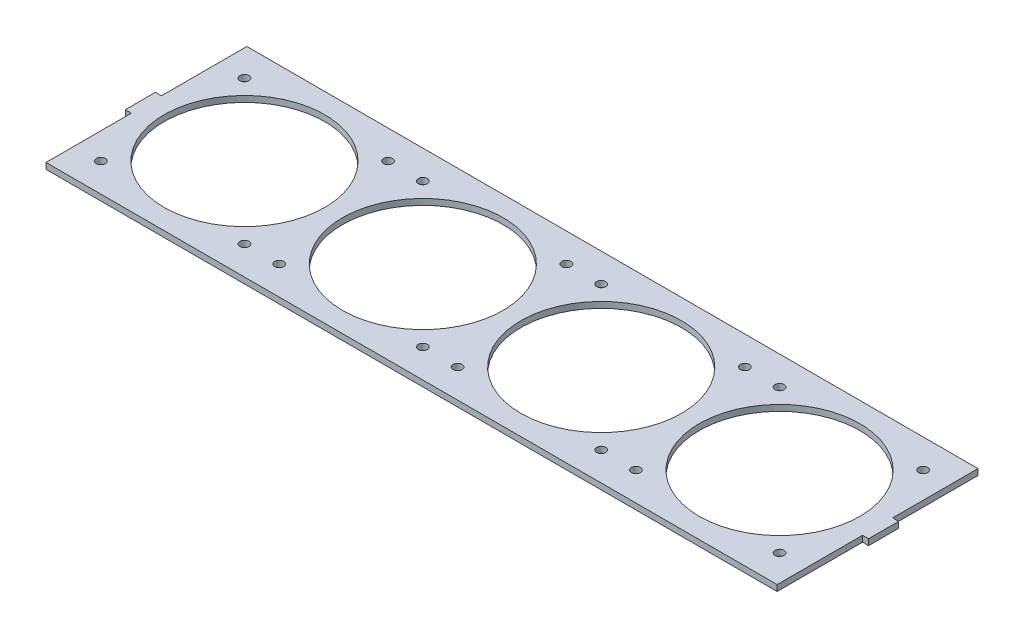
ISO-10303-21;
HEADER;
FILE_DESCRIPTION(('STEP AP214'),'2;1');
FILE_NAME('part.step','',(''),(''),'','','');
FILE_SCHEMA(('AUTOMOTIVE_DESIGN { 1 0 10303 214 1 1 1 1 }'));
ENDSEC;
DATA;
#1=APPLICATION_CONTEXT('core data for automotive mechanical design processes');
#2=APPLICATION_PROTOCOL_DEFINITION('international standard','automotive_design',2000,#1);
#3=PRODUCT_CONTEXT('',#1,'mechanical');
#4=PRODUCT('Part','Part','',(#3));
#5=PRODUCT_RELATED_PRODUCT_CATEGORY('part','',(#4));
#6=PRODUCT_DEFINITION_FORMATION('','',#4);
#7=PRODUCT_DEFINITION_CONTEXT('part definition',#1,'design');
#8=PRODUCT_DEFINITION('design','',#6,#7);
#9=PRODUCT_DEFINITION_SHAPE('','',#8);
#10=(LENGTH_UNIT() NAMED_UNIT(*) SI_UNIT(.MILLI.,.METRE.));
#11=(NAMED_UNIT(*) PLANE_ANGLE_UNIT() SI_UNIT($,.RADIAN.));
#12=(NAMED_UNIT(*) SI_UNIT($,.STERADIAN.) SOLID_ANGLE_UNIT());
#13=UNCERTAINTY_MEASURE_WITH_UNIT(LENGTH_MEASURE(1.E-05),#10,'distance_accuracy_value','');
#14=(GEOMETRIC_REPRESENTATION_CONTEXT(3) GLOBAL_UNCERTAINTY_ASSIGNED_CONTEXT((#13)) GLOBAL_UNIT_ASSIGNED_CONTEXT((#10,
#11,#12)) REPRESENTATION_CONTEXT('',''));
#15=CARTESIAN_POINT('',(0.,0.,0.));
#16=DIRECTION('',(0.,0.,1.));
#17=DIRECTION('',(1.,0.,0.));
#18=AXIS2_PLACEMENT_3D('',#15,#16,#17);
#19=CARTESIAN_POINT('',(0.,3.,0.));
#20=DIRECTION('',(0.,-1.,0.));
#21=DIRECTION('',(0.,0.,-1.));
#22=AXIS2_PLACEMENT_3D('',#19,#20,#21);
#23=PLANE('',#22);
#24=DIRECTION('',(0.,0.,1.));
#25=VECTOR('',#24,1.);
#26=CARTESIAN_POINT('',(-288.537869001243,3.,-7.43515636029034));
#27=LINE('',#26,#25);
#28=CARTESIAN_POINT('',(-288.537869001243,3.,-7.43515636029034));
#29=VERTEX_POINT('',#28);
#30=CARTESIAN_POINT('',(-288.537869001243,3.,35.0648436397097));
#31=VERTEX_POINT('',#30);
#32=EDGE_CURVE('E180',#29,#31,#27,.T.);
#33=ORIENTED_EDGE('',*,*,#32,.T.);
#34=DIRECTION('',(1.,0.,0.));
#35=VECTOR('',#34,1.);
#36=CARTESIAN_POINT('',(75.4621309987569,3.,35.0648436397097));
#37=LINE('',#36,#35);
#38=CARTESIAN_POINT('',(75.4621309987569,3.,35.0648436397097));
#39=VERTEX_POINT('',#38);
#40=EDGE_CURVE('E108',#31,#39,#37,.T.);
#41=ORIENTED_EDGE('',*,*,#40,.T.);
#42=DIRECTION('',(0.,0.,-1.));
#43=VECTOR('',#42,1.);
#44=CARTESIAN_POINT('',(75.4621309987569,3.,-7.43515636029031));
#45=LINE('',#44,#43);
#46=CARTESIAN_POINT('',(75.4621309987569,3.,-7.43515636029031));
#47=VERTEX_POINT('',#46);
#48=EDGE_CURVE('E207',#39,#47,#45,.T.);
#49=ORIENTED_EDGE('',*,*,#48,.T.);
#50=DIRECTION('',(1.,0.,0.));
#51=VECTOR('',#50,1.);
#52=CARTESIAN_POINT('',(78.4621309987569,3.,-7.4351563602903));
#53=LINE('',#52,#51);
#54=CARTESIAN_POINT('',(78.4621309987569,3.,-7.4351563602903));
#55=VERTEX_POINT('',#54);
#56=EDGE_CURVE('E226',#47,#55,#53,.T.);
#57=ORIENTED_EDGE('',*,*,#56,.T.);
#58=DIRECTION('',(0.,0.,-1.));
#59=VECTOR('',#58,1.);
#60=CARTESIAN_POINT('',(78.4621309987569,3.,-7.4351563602903));
#61=LINE('',#60,#59);
#62=CARTESIAN_POINT('',(78.4621309987569,3.,-22.4351563602903));
#63=VERTEX_POINT('',#62);
#64=EDGE_CURVE('E223',#55,#63,#61,.T.);
#65=ORIENTED_EDGE('',*,*,#64,.T.);
#66=DIRECTION('',(-1.,0.,0.));
#67=VECTOR('',#66,1.);
#68=CARTESIAN_POINT('',(78.4621309987569,3.,-22.4351563602903));
#69=LINE('',#68,#67);
#70=CARTESIAN_POINT('',(75.4621309987569,3.,-22.4351563602903));
#71=VERTEX_POINT('',#70);
#72=EDGE_CURVE('E225',#63,#71,#69,.T.);
#73=ORIENTED_EDGE('',*,*,#72,.T.);
#74=DIRECTION('',(0.,0.,-1.));
#75=VECTOR('',#74,1.);
#76=CARTESIAN_POINT('',(75.4621309987569,3.,-64.9351563602903));
#77=LINE('',#76,#75);
#78=CARTESIAN_POINT('',(75.4621309987569,3.,-64.9351563602903));
#79=VERTEX_POINT('',#78);
#80=EDGE_CURVE('E228',#71,#79,#77,.T.);
#81=ORIENTED_EDGE('',*,*,#80,.T.);
#82=DIRECTION('',(-1.,0.,0.));
#83=VECTOR('',#82,1.);
#84=CARTESIAN_POINT('',(75.4621309987569,3.,-64.9351563602903));
#85=LINE('',#84,#83);
#86=CARTESIAN_POINT('',(-288.537869001243,3.,-64.9351563602903));
#87=VERTEX_POINT('',#86);
#88=EDGE_CURVE('E234',#79,#87,#85,.T.);
#89=ORIENTED_EDGE('',*,*,#88,.T.);
#90=DIRECTION('',(0.,0.,1.));
#91=VECTOR('',#90,1.);
#92=CARTESIAN_POINT('',(-288.537869001243,3.,-64.9351563602903));
#93=LINE('',#92,#91);
#94=CARTESIAN_POINT('',(-288.537869001243,3.,-22.4351563602903));
#95=VERTEX_POINT('',#94);
#96=EDGE_CURVE('E139',#87,#95,#93,.T.);
#97=ORIENTED_EDGE('',*,*,#96,.T.);
#98=DIRECTION('',(-1.,0.,0.));
#99=VECTOR('',#98,1.);
#100=CARTESIAN_POINT('',(-291.537869001243,3.,-22.4351563602903));
#101=LINE('',#100,#99);
#102=CARTESIAN_POINT('',(-291.537869001243,3.,-22.4351563602903));
#103=VERTEX_POINT('',#102);
#104=EDGE_CURVE('E133',#95,#103,#101,.T.);
#105=ORIENTED_EDGE('',*,*,#104,.T.);
#106=DIRECTION('',(0.,0.,1.));
#107=VECTOR('',#106,1.);
#108=CARTESIAN_POINT('',(-291.537869001243,3.,-7.43515636029033));
#109=LINE('',#108,#107);
#110=CARTESIAN_POINT('',(-291.537869001243,3.,-7.43515636029033));
#111=VERTEX_POINT('',#110);
#112=EDGE_CURVE('E137',#103,#111,#109,.T.);
#113=ORIENTED_EDGE('',*,*,#112,.T.);
#114=DIRECTION('',(1.,0.,0.));
#115=VECTOR('',#114,1.);
#116=CARTESIAN_POINT('',(-291.537869001243,3.,-7.43515636029033));
#117=LINE('',#116,#115);
#118=EDGE_CURVE('E53',#111,#29,#117,.T.);
#119=ORIENTED_EDGE('',*,*,#118,.T.);
#120=EDGE_LOOP('',(#33,#41,#49,#57,#65,#73,#81,#89,#97,#105,#113,#119));
#121=FACE_BOUND('',#120,.T.);
#122=CARTESIAN_POINT('',(-239.737869001243,3.,-14.9351563602903));
#123=DIRECTION('',(0.,1.,0.));
#124=DIRECTION('',(0.,0.,1.));
#125=AXIS2_PLACEMENT_3D('',#122,#123,#124);
#126=CIRCLE('',#125,40.);
#127=CARTESIAN_POINT('',(-239.737869001243,3.,25.0648436397097));
#128=VERTEX_POINT('',#127);
#129=EDGE_CURVE('E161',#128,#128,#126,.T.);
#130=ORIENTED_EDGE('',*,*,#129,.F.);
#131=EDGE_LOOP('',(#130));
#132=FACE_BOUND('',#131,.T.);
#133=CARTESIAN_POINT('',(-150.937869001243,3.,-14.9351563602903));
#134=DIRECTION('',(0.,1.,0.));
#135=DIRECTION('',(0.,0.,1.));
#136=AXIS2_PLACEMENT_3D('',#133,#134,#135);
#137=CIRCLE('',#136,40.);
#138=CARTESIAN_POINT('',(-150.937869001243,3.,25.0648436397097));
#139=VERTEX_POINT('',#138);
#140=EDGE_CURVE('E458',#139,#139,#137,.T.);
#141=ORIENTED_EDGE('',*,*,#140,.F.);
#142=EDGE_LOOP('',(#141));
#143=FACE_BOUND('',#142,.T.);
#144=CARTESIAN_POINT('',(-115.187869001243,3.,20.8148436397098));
#145=DIRECTION('',(0.,1.,0.));
#146=DIRECTION('',(0.,0.,-1.));
#147=AXIS2_PLACEMENT_3D('',#144,#145,#146);
#148=CIRCLE('',#147,2.25000000000001);
#149=CARTESIAN_POINT('',(-115.187869001243,3.,18.5648436397097));
#150=VERTEX_POINT('',#149);
#151=EDGE_CURVE('E452',#150,#150,#148,.T.);
#152=ORIENTED_EDGE('',*,*,#151,.F.);
#153=EDGE_LOOP('',(#152));
#154=FACE_BOUND('',#153,.T.);
#155=CARTESIAN_POINT('',(-203.987869001243,3.,20.8148436397098));
#156=DIRECTION('',(0.,1.,0.));
#157=DIRECTION('',(0.,0.,-1.));
#158=AXIS2_PLACEMENT_3D('',#155,#156,#157);
#159=CIRCLE('',#158,2.25000000000001);
#160=CARTESIAN_POINT('',(-203.987869001243,3.,18.5648436397097));
#161=VERTEX_POINT('',#160);
#162=EDGE_CURVE('E446',#161,#161,#159,.T.);
#163=ORIENTED_EDGE('',*,*,#162,.F.);
#164=EDGE_LOOP('',(#163));
#165=FACE_BOUND('',#164,.T.);
#166=CARTESIAN_POINT('',(-275.487869001243,3.,20.8148436397098));
#167=DIRECTION('',(0.,1.,0.));
#168=DIRECTION('',(0.,0.,1.));
#169=AXIS2_PLACEMENT_3D('',#166,#167,#168);
#170=CIRCLE('',#169,2.25000000000001);
#171=CARTESIAN_POINT('',(-275.487869001243,3.,23.0648436397098));
#172=VERTEX_POINT('',#171);
#173=EDGE_CURVE('E440',#172,#172,#170,.T.);
#174=ORIENTED_EDGE('',*,*,#173,.F.);
#175=EDGE_LOOP('',(#174));
#176=FACE_BOUND('',#175,.T.);
#177=CARTESIAN_POINT('',(-275.487869001243,3.,-50.6851563602904));
#178=DIRECTION('',(0.,1.,0.));
#179=DIRECTION('',(0.,0.,-1.));
#180=AXIS2_PLACEMENT_3D('',#177,#178,#179);
#181=CIRCLE('',#180,2.25000000000001);
#182=CARTESIAN_POINT('',(-275.487869001243,3.,-52.9351563602904));
#183=VERTEX_POINT('',#182);
#184=EDGE_CURVE('E434',#183,#183,#181,.T.);
#185=ORIENTED_EDGE('',*,*,#184,.F.);
#186=EDGE_LOOP('',(#185));
#187=FACE_BOUND('',#186,.T.);
#188=CARTESIAN_POINT('',(-186.687869001243,3.,20.8148436397098));
#189=DIRECTION('',(0.,1.,0.));
#190=DIRECTION('',(0.,0.,1.));
#191=AXIS2_PLACEMENT_3D('',#188,#189,#190);
#192=CIRCLE('',#191,2.25000000000001);
#193=CARTESIAN_POINT('',(-186.687869001243,3.,23.0648436397098));
#194=VERTEX_POINT('',#193);
#195=EDGE_CURVE('E428',#194,#194,#192,.T.);
#196=ORIENTED_EDGE('',*,*,#195,.F.);
#197=EDGE_LOOP('',(#196));
#198=FACE_BOUND('',#197,.T.);
#199=CARTESIAN_POINT('',(-186.687869001243,3.,-50.6851563602904));
#200=DIRECTION('',(0.,1.,0.));
#201=DIRECTION('',(0.,0.,-1.));
#202=AXIS2_PLACEMENT_3D('',#199,#200,#201);
#203=CIRCLE('',#202,2.25000000000001);
#204=CARTESIAN_POINT('',(-186.687869001243,3.,-52.9351563602904));
#205=VERTEX_POINT('',#204);
#206=EDGE_CURVE('E422',#205,#205,#203,.T.);
#207=ORIENTED_EDGE('',*,*,#206,.F.);
#208=EDGE_LOOP('',(#207));
#209=FACE_BOUND('',#208,.T.);
#210=CARTESIAN_POINT('',(-115.187869001243,3.,-50.6851563602904));
#211=DIRECTION('',(0.,1.,0.));
#212=DIRECTION('',(0.,0.,1.));
#213=AXIS2_PLACEMENT_3D('',#210,#211,#212);
#214=CIRCLE('',#213,2.25000000000001);
#215=CARTESIAN_POINT('',(-115.187869001243,3.,-48.4351563602903));
#216=VERTEX_POINT('',#215);
#217=EDGE_CURVE('E416',#216,#216,#214,.T.);
#218=ORIENTED_EDGE('',*,*,#217,.F.);
#219=EDGE_LOOP('',(#218));
#220=FACE_BOUND('',#219,.T.);
#221=CARTESIAN_POINT('',(-62.137869001243,3.,-14.9351563602903));
#222=DIRECTION('',(0.,1.,0.));
#223=DIRECTION('',(0.,0.,1.));
#224=AXIS2_PLACEMENT_3D('',#221,#222,#223);
#225=CIRCLE('',#224,40.);
#226=CARTESIAN_POINT('',(-62.137869001243,3.,25.0648436397097));
#227=VERTEX_POINT('',#226);
#228=EDGE_CURVE('E410',#227,#227,#225,.T.);
#229=ORIENTED_EDGE('',*,*,#228,.F.);
#230=EDGE_LOOP('',(#229));
#231=FACE_BOUND('',#230,.T.);
#232=CARTESIAN_POINT('',(-26.387869001243,3.,20.8148436397098));
#233=DIRECTION('',(0.,1.,0.));
#234=DIRECTION('',(0.,0.,-1.));
#235=AXIS2_PLACEMENT_3D('',#232,#233,#234);
#236=CIRCLE('',#235,2.25000000000001);
#237=CARTESIAN_POINT('',(-26.387869001243,3.,18.5648436397097));
#238=VERTEX_POINT('',#237);
#239=EDGE_CURVE('E404',#238,#238,#236,.T.);
#240=ORIENTED_EDGE('',*,*,#239,.F.);
#241=EDGE_LOOP('',(#240));
#242=FACE_BOUND('',#241,.T.);
#243=CARTESIAN_POINT('',(-203.987869001243,3.,-50.6851563602904));
#244=DIRECTION('',(0.,1.,0.));
#245=DIRECTION('',(0.,0.,1.));
#246=AXIS2_PLACEMENT_3D('',#243,#244,#245);
#247=CIRCLE('',#246,2.25000000000001);
#248=CARTESIAN_POINT('',(-203.987869001243,3.,-48.4351563602903));
#249=VERTEX_POINT('',#248);
#250=EDGE_CURVE('E398',#249,#249,#247,.T.);
#251=ORIENTED_EDGE('',*,*,#250,.F.);
#252=EDGE_LOOP('',(#251));
#253=FACE_BOUND('',#252,.T.);
#254=CARTESIAN_POINT('',(-97.8878690012431,3.,20.8148436397098));
#255=DIRECTION('',(0.,1.,0.));
#256=DIRECTION('',(0.,0.,1.));
#257=AXIS2_PLACEMENT_3D('',#254,#255,#256);
#258=CIRCLE('',#257,2.25000000000001);
#259=CARTESIAN_POINT('',(-97.8878690012431,3.,23.0648436397098));
#260=VERTEX_POINT('',#259);
#261=EDGE_CURVE('E392',#260,#260,#258,.T.);
#262=ORIENTED_EDGE('',*,*,#261,.F.);
#263=EDGE_LOOP('',(#262));
#264=FACE_BOUND('',#263,.T.);
#265=CARTESIAN_POINT('',(-97.8878690012431,3.,-50.6851563602904));
#266=DIRECTION('',(0.,1.,0.));
#267=DIRECTION('',(0.,0.,-1.));
#268=AXIS2_PLACEMENT_3D('',#265,#266,#267);
#269=CIRCLE('',#268,2.25000000000001);
#270=CARTESIAN_POINT('',(-97.8878690012431,3.,-52.9351563602904));
#271=VERTEX_POINT('',#270);
#272=EDGE_CURVE('E386',#271,#271,#269,.T.);
#273=ORIENTED_EDGE('',*,*,#272,.F.);
#274=EDGE_LOOP('',(#273));
#275=FACE_BOUND('',#274,.T.);
#276=CARTESIAN_POINT('',(-26.387869001243,3.,-50.6851563602904));
#277=DIRECTION('',(0.,1.,0.));
#278=DIRECTION('',(0.,0.,1.));
#279=AXIS2_PLACEMENT_3D('',#276,#277,#278);
#280=CIRCLE('',#279,2.25000000000001);
#281=CARTESIAN_POINT('',(-26.387869001243,3.,-48.4351563602903));
#282=VERTEX_POINT('',#281);
#283=EDGE_CURVE('E380',#282,#282,#280,.T.);
#284=ORIENTED_EDGE('',*,*,#283,.F.);
#285=EDGE_LOOP('',(#284));
#286=FACE_BOUND('',#285,.T.);
#287=CARTESIAN_POINT('',(26.662130998757,3.,-14.9351563602903));
#288=DIRECTION('',(0.,1.,0.));
#289=DIRECTION('',(0.,0.,1.));
#290=AXIS2_PLACEMENT_3D('',#287,#288,#289);
#291=CIRCLE('',#290,40.);
#292=CARTESIAN_POINT('',(26.662130998757,3.,25.0648436397097));
#293=VERTEX_POINT('',#292);
#294=EDGE_CURVE('E374',#293,#293,#291,.T.);
#295=ORIENTED_EDGE('',*,*,#294,.F.);
#296=EDGE_LOOP('',(#295));
#297=FACE_BOUND('',#296,.T.);
#298=CARTESIAN_POINT('',(62.412130998757,3.,20.8148436397098));
#299=DIRECTION('',(0.,1.,0.));
#300=DIRECTION('',(0.,0.,-1.));
#301=AXIS2_PLACEMENT_3D('',#298,#299,#300);
#302=CIRCLE('',#301,2.25000000000001);
#303=CARTESIAN_POINT('',(62.412130998757,3.,18.5648436397097));
#304=VERTEX_POINT('',#303);
#305=EDGE_CURVE('E368',#304,#304,#302,.T.);
#306=ORIENTED_EDGE('',*,*,#305,.F.);
#307=EDGE_LOOP('',(#306));
#308=FACE_BOUND('',#307,.T.);
#309=CARTESIAN_POINT('',(-9.08786900124309,3.,20.8148436397098));
#310=DIRECTION('',(0.,1.,0.));
#311=DIRECTION('',(0.,0.,1.));
#312=AXIS2_PLACEMENT_3D('',#309,#310,#311);
#313=CIRCLE('',#312,2.25000000000001);
#314=CARTESIAN_POINT('',(-9.08786900124309,3.,23.0648436397098));
#315=VERTEX_POINT('',#314);
#316=EDGE_CURVE('E362',#315,#315,#313,.T.);
#317=ORIENTED_EDGE('',*,*,#316,.F.);
#318=EDGE_LOOP('',(#317));
#319=FACE_BOUND('',#318,.T.);
#320=CARTESIAN_POINT('',(-9.08786900124309,3.,-50.6851563602904));
#321=DIRECTION('',(0.,1.,0.));
#322=DIRECTION('',(0.,0.,-1.));
#323=AXIS2_PLACEMENT_3D('',#320,#321,#322);
#324=CIRCLE('',#323,2.25000000000001);
#325=CARTESIAN_POINT('',(-9.08786900124309,3.,-52.9351563602904));
#326=VERTEX_POINT('',#325);
#327=EDGE_CURVE('E356',#326,#326,#324,.T.);
#328=ORIENTED_EDGE('',*,*,#327,.F.);
#329=EDGE_LOOP('',(#328));
#330=FACE_BOUND('',#329,.T.);
#331=CARTESIAN_POINT('',(62.412130998757,3.,-50.6851563602904));
#332=DIRECTION('',(0.,1.,0.));
#333=DIRECTION('',(0.,0.,1.));
#334=AXIS2_PLACEMENT_3D('',#331,#332,#333);
#335=CIRCLE('',#334,2.25000000000001);
#336=CARTESIAN_POINT('',(62.412130998757,3.,-48.4351563602903));
#337=VERTEX_POINT('',#336);
#338=EDGE_CURVE('E347',#337,#337,#335,.T.);
#339=ORIENTED_EDGE('',*,*,#338,.F.);
#340=EDGE_LOOP('',(#339));
#341=FACE_BOUND('',#340,.T.);
#342=ADVANCED_FACE('F36',(#121,#132,#143,#154,#165,#176,#187,#198,#209,#220,#231,#242,#253,#264,
#275,#286,#297,#308,#319,#330,#341),#23,.F.);
#343=CARTESIAN_POINT('',(0.,0.,0.));
#344=DIRECTION('',(0.,-1.,0.));
#345=DIRECTION('',(0.,0.,-1.));
#346=AXIS2_PLACEMENT_3D('',#343,#344,#345);
#347=PLANE('',#346);
#348=CARTESIAN_POINT('',(-9.08786900124309,0.,-50.6851563602904));
#349=DIRECTION('',(0.,1.,0.));
#350=DIRECTION('',(0.,0.,-1.));
#351=AXIS2_PLACEMENT_3D('',#348,#349,#350);
#352=CIRCLE('',#351,2.25000000000001);
#353=CARTESIAN_POINT('',(-9.08786900124309,0.,-52.9351563602904));
#354=VERTEX_POINT('',#353);
#355=EDGE_CURVE('E353',#354,#354,#352,.T.);
#356=ORIENTED_EDGE('',*,*,#355,.T.);
#357=EDGE_LOOP('',(#356));
#358=FACE_BOUND('',#357,.T.);
#359=CARTESIAN_POINT('',(62.412130998757,0.,20.8148436397098));
#360=DIRECTION('',(0.,1.,0.));
#361=DIRECTION('',(0.,0.,-1.));
#362=AXIS2_PLACEMENT_3D('',#359,#360,#361);
#363=CIRCLE('',#362,2.25000000000001);
#364=CARTESIAN_POINT('',(62.412130998757,0.,18.5648436397097));
#365=VERTEX_POINT('',#364);
#366=EDGE_CURVE('E365',#365,#365,#363,.T.);
#367=ORIENTED_EDGE('',*,*,#366,.T.);
#368=EDGE_LOOP('',(#367));
#369=FACE_BOUND('',#368,.T.);
#370=CARTESIAN_POINT('',(-26.387869001243,0.,-50.6851563602904));
#371=DIRECTION('',(0.,1.,0.));
#372=DIRECTION('',(0.,0.,1.));
#373=AXIS2_PLACEMENT_3D('',#370,#371,#372);
#374=CIRCLE('',#373,2.25000000000001);
#375=CARTESIAN_POINT('',(-26.387869001243,0.,-48.4351563602903));
#376=VERTEX_POINT('',#375);
#377=EDGE_CURVE('E377',#376,#376,#374,.T.);
#378=ORIENTED_EDGE('',*,*,#377,.T.);
#379=EDGE_LOOP('',(#378));
#380=FACE_BOUND('',#379,.T.);
#381=CARTESIAN_POINT('',(-97.8878690012431,0.,20.8148436397098));
#382=DIRECTION('',(0.,1.,0.));
#383=DIRECTION('',(0.,0.,1.));
#384=AXIS2_PLACEMENT_3D('',#381,#382,#383);
#385=CIRCLE('',#384,2.25000000000001);
#386=CARTESIAN_POINT('',(-97.8878690012431,0.,23.0648436397098));
#387=VERTEX_POINT('',#386);
#388=EDGE_CURVE('E389',#387,#387,#385,.T.);
#389=ORIENTED_EDGE('',*,*,#388,.T.);
#390=EDGE_LOOP('',(#389));
#391=FACE_BOUND('',#390,.T.);
#392=CARTESIAN_POINT('',(-26.387869001243,0.,20.8148436397098));
#393=DIRECTION('',(0.,1.,0.));
#394=DIRECTION('',(0.,0.,-1.));
#395=AXIS2_PLACEMENT_3D('',#392,#393,#394);
#396=CIRCLE('',#395,2.25000000000001);
#397=CARTESIAN_POINT('',(-26.387869001243,0.,18.5648436397097));
#398=VERTEX_POINT('',#397);
#399=EDGE_CURVE('E401',#398,#398,#396,.T.);
#400=ORIENTED_EDGE('',*,*,#399,.T.);
#401=EDGE_LOOP('',(#400));
#402=FACE_BOUND('',#401,.T.);
#403=CARTESIAN_POINT('',(-115.187869001243,0.,-50.6851563602904));
#404=DIRECTION('',(0.,1.,0.));
#405=DIRECTION('',(0.,0.,1.));
#406=AXIS2_PLACEMENT_3D('',#403,#404,#405);
#407=CIRCLE('',#406,2.25000000000001);
#408=CARTESIAN_POINT('',(-115.187869001243,0.,-48.4351563602903));
#409=VERTEX_POINT('',#408);
#410=EDGE_CURVE('E413',#409,#409,#407,.T.);
#411=ORIENTED_EDGE('',*,*,#410,.T.);
#412=EDGE_LOOP('',(#411));
#413=FACE_BOUND('',#412,.T.);
#414=CARTESIAN_POINT('',(-186.687869001243,0.,20.8148436397098));
#415=DIRECTION('',(0.,1.,0.));
#416=DIRECTION('',(0.,0.,1.));
#417=AXIS2_PLACEMENT_3D('',#414,#415,#416);
#418=CIRCLE('',#417,2.25000000000001);
#419=CARTESIAN_POINT('',(-186.687869001243,0.,23.0648436397098));
#420=VERTEX_POINT('',#419);
#421=EDGE_CURVE('E425',#420,#420,#418,.T.);
#422=ORIENTED_EDGE('',*,*,#421,.T.);
#423=EDGE_LOOP('',(#422));
#424=FACE_BOUND('',#423,.T.);
#425=CARTESIAN_POINT('',(-275.487869001243,0.,20.8148436397098));
#426=DIRECTION('',(0.,1.,0.));
#427=DIRECTION('',(0.,0.,1.));
#428=AXIS2_PLACEMENT_3D('',#425,#426,#427);
#429=CIRCLE('',#428,2.25000000000001);
#430=CARTESIAN_POINT('',(-275.487869001243,0.,23.0648436397098));
#431=VERTEX_POINT('',#430);
#432=EDGE_CURVE('E437',#431,#431,#429,.T.);
#433=ORIENTED_EDGE('',*,*,#432,.T.);
#434=EDGE_LOOP('',(#433));
#435=FACE_BOUND('',#434,.T.);
#436=CARTESIAN_POINT('',(-115.187869001243,0.,20.8148436397098));
#437=DIRECTION('',(0.,1.,0.));
#438=DIRECTION('',(0.,0.,-1.));
#439=AXIS2_PLACEMENT_3D('',#436,#437,#438);
#440=CIRCLE('',#439,2.25000000000001);
#441=CARTESIAN_POINT('',(-115.187869001243,0.,18.5648436397097));
#442=VERTEX_POINT('',#441);
#443=EDGE_CURVE('E449',#442,#442,#440,.T.);
#444=ORIENTED_EDGE('',*,*,#443,.T.);
#445=EDGE_LOOP('',(#444));
#446=FACE_BOUND('',#445,.T.);
#447=CARTESIAN_POINT('',(-239.737869001243,0.,-14.9351563602903));
#448=DIRECTION('',(0.,1.,0.));
#449=DIRECTION('',(0.,0.,1.));
#450=AXIS2_PLACEMENT_3D('',#447,#448,#449);
#451=CIRCLE('',#450,40.);
#452=CARTESIAN_POINT('',(-239.737869001243,0.,25.0648436397097));
#453=VERTEX_POINT('',#452);
#454=EDGE_CURVE('E461',#453,#453,#451,.T.);
#455=ORIENTED_EDGE('',*,*,#454,.T.);
#456=EDGE_LOOP('',(#455));
#457=FACE_BOUND('',#456,.T.);
#458=DIRECTION('',(0.,0.,1.));
#459=VECTOR('',#458,1.);
#460=CARTESIAN_POINT('',(-288.537869001243,0.,-7.43515636029034));
#461=LINE('',#460,#459);
#462=CARTESIAN_POINT('',(-288.537869001243,0.,-7.43515636029034));
#463=VERTEX_POINT('',#462);
#464=CARTESIAN_POINT('',(-288.537869001243,0.,35.0648436397097));
#465=VERTEX_POINT('',#464);
#466=EDGE_CURVE('E157',#463,#465,#461,.T.);
#467=ORIENTED_EDGE('',*,*,#466,.F.);
#468=DIRECTION('',(1.,0.,0.));
#469=VECTOR('',#468,1.);
#470=CARTESIAN_POINT('',(-291.537869001243,0.,-7.43515636029033));
#471=LINE('',#470,#469);
#472=CARTESIAN_POINT('',(-291.537869001243,0.,-7.43515636029033));
#473=VERTEX_POINT('',#472);
#474=EDGE_CURVE('E100',#473,#463,#471,.T.);
#475=ORIENTED_EDGE('',*,*,#474,.F.);
#476=DIRECTION('',(0.,0.,1.));
#477=VECTOR('',#476,1.);
#478=CARTESIAN_POINT('',(-291.537869001243,0.,-7.43515636029033));
#479=LINE('',#478,#477);
#480=CARTESIAN_POINT('',(-291.537869001243,0.,-22.4351563602903));
#481=VERTEX_POINT('',#480);
#482=EDGE_CURVE('E94',#481,#473,#479,.T.);
#483=ORIENTED_EDGE('',*,*,#482,.F.);
#484=DIRECTION('',(-1.,0.,0.));
#485=VECTOR('',#484,1.);
#486=CARTESIAN_POINT('',(-291.537869001243,0.,-22.4351563602903));
#487=LINE('',#486,#485);
#488=CARTESIAN_POINT('',(-288.537869001243,0.,-22.4351563602903));
#489=VERTEX_POINT('',#488);
#490=EDGE_CURVE('E147',#489,#481,#487,.T.);
#491=ORIENTED_EDGE('',*,*,#490,.F.);
#492=DIRECTION('',(0.,0.,1.));
#493=VECTOR('',#492,1.);
#494=CARTESIAN_POINT('',(-288.537869001243,0.,-64.9351563602903));
#495=LINE('',#494,#493);
#496=CARTESIAN_POINT('',(-288.537869001243,0.,-64.9351563602903));
#497=VERTEX_POINT('',#496);
#498=EDGE_CURVE('E175',#497,#489,#495,.T.);
#499=ORIENTED_EDGE('',*,*,#498,.F.);
#500=DIRECTION('',(-1.,0.,0.));
#501=VECTOR('',#500,1.);
#502=CARTESIAN_POINT('',(75.4621309987569,0.,-64.9351563602903));
#503=LINE('',#502,#501);
#504=CARTESIAN_POINT('',(75.4621309987569,0.,-64.9351563602903));
#505=VERTEX_POINT('',#504);
#506=EDGE_CURVE('E173',#505,#497,#503,.T.);
#507=ORIENTED_EDGE('',*,*,#506,.F.);
#508=DIRECTION('',(0.,0.,-1.));
#509=VECTOR('',#508,1.);
#510=CARTESIAN_POINT('',(75.4621309987569,0.,-64.9351563602903));
#511=LINE('',#510,#509);
#512=CARTESIAN_POINT('',(75.4621309987569,0.,-22.4351563602903));
#513=VERTEX_POINT('',#512);
#514=EDGE_CURVE('E171',#513,#505,#511,.T.);
#515=ORIENTED_EDGE('',*,*,#514,.F.);
#516=DIRECTION('',(-1.,0.,0.));
#517=VECTOR('',#516,1.);
#518=CARTESIAN_POINT('',(78.4621309987569,0.,-22.4351563602903));
#519=LINE('',#518,#517);
#520=CARTESIAN_POINT('',(78.4621309987569,0.,-22.4351563602903));
#521=VERTEX_POINT('',#520);
#522=EDGE_CURVE('E169',#521,#513,#519,.T.);
#523=ORIENTED_EDGE('',*,*,#522,.F.);
#524=DIRECTION('',(0.,0.,-1.));
#525=VECTOR('',#524,1.);
#526=CARTESIAN_POINT('',(78.4621309987569,0.,-7.4351563602903));
#527=LINE('',#526,#525);
#528=CARTESIAN_POINT('',(78.4621309987569,0.,-7.4351563602903));
#529=VERTEX_POINT('',#528);
#530=EDGE_CURVE('E167',#529,#521,#527,.T.);
#531=ORIENTED_EDGE('',*,*,#530,.F.);
#532=DIRECTION('',(1.,0.,0.));
#533=VECTOR('',#532,1.);
#534=CARTESIAN_POINT('',(78.4621309987569,0.,-7.4351563602903));
#535=LINE('',#534,#533);
#536=CARTESIAN_POINT('',(75.4621309987569,0.,-7.43515636029031));
#537=VERTEX_POINT('',#536);
#538=EDGE_CURVE('E165',#537,#529,#535,.T.);
#539=ORIENTED_EDGE('',*,*,#538,.F.);
#540=DIRECTION('',(0.,0.,-1.));
#541=VECTOR('',#540,1.);
#542=CARTESIAN_POINT('',(75.4621309987569,0.,-7.43515636029031));
#543=LINE('',#542,#541);
#544=CARTESIAN_POINT('',(75.4621309987569,0.,35.0648436397097));
#545=VERTEX_POINT('',#544);
#546=EDGE_CURVE('E163',#545,#537,#543,.T.);
#547=ORIENTED_EDGE('',*,*,#546,.F.);
#548=DIRECTION('',(1.,0.,0.));
#549=VECTOR('',#548,1.);
#550=CARTESIAN_POINT('',(75.4621309987569,0.,35.0648436397097));
#551=LINE('',#550,#549);
#552=EDGE_CURVE('E160',#465,#545,#551,.T.);
#553=ORIENTED_EDGE('',*,*,#552,.F.);
#554=EDGE_LOOP('',(#467,#475,#483,#491,#499,#507,#515,#523,#531,#539,#547,#553));
#555=FACE_BOUND('',#554,.T.);
#556=CARTESIAN_POINT('',(-150.937869001243,0.,-14.9351563602903));
#557=DIRECTION('',(0.,1.,0.));
#558=DIRECTION('',(0.,0.,1.));
#559=AXIS2_PLACEMENT_3D('',#556,#557,#558);
#560=CIRCLE('',#559,40.);
#561=CARTESIAN_POINT('',(-150.937869001243,0.,25.0648436397097));
#562=VERTEX_POINT('',#561);
#563=EDGE_CURVE('E455',#562,#562,#560,.T.);
#564=ORIENTED_EDGE('',*,*,#563,.T.);
#565=EDGE_LOOP('',(#564));
#566=FACE_BOUND('',#565,.T.);
#567=CARTESIAN_POINT('',(-203.987869001243,0.,20.8148436397098));
#568=DIRECTION('',(0.,1.,0.));
#569=DIRECTION('',(0.,0.,-1.));
#570=AXIS2_PLACEMENT_3D('',#567,#568,#569);
#571=CIRCLE('',#570,2.25000000000001);
#572=CARTESIAN_POINT('',(-203.987869001243,0.,18.5648436397097));
#573=VERTEX_POINT('',#572);
#574=EDGE_CURVE('E443',#573,#573,#571,.T.);
#575=ORIENTED_EDGE('',*,*,#574,.T.);
#576=EDGE_LOOP('',(#575));
#577=FACE_BOUND('',#576,.T.);
#578=CARTESIAN_POINT('',(-275.487869001243,0.,-50.6851563602904));
#579=DIRECTION('',(0.,1.,0.));
#580=DIRECTION('',(0.,0.,-1.));
#581=AXIS2_PLACEMENT_3D('',#578,#579,#580);
#582=CIRCLE('',#581,2.25000000000001);
#583=CARTESIAN_POINT('',(-275.487869001243,0.,-52.9351563602904));
#584=VERTEX_POINT('',#583);
#585=EDGE_CURVE('E431',#584,#584,#582,.T.);
#586=ORIENTED_EDGE('',*,*,#585,.T.);
#587=EDGE_LOOP('',(#586));
#588=FACE_BOUND('',#587,.T.);
#589=CARTESIAN_POINT('',(-186.687869001243,0.,-50.6851563602904));
#590=DIRECTION('',(0.,1.,0.));
#591=DIRECTION('',(0.,0.,-1.));
#592=AXIS2_PLACEMENT_3D('',#589,#590,#591);
#593=CIRCLE('',#592,2.25000000000001);
#594=CARTESIAN_POINT('',(-186.687869001243,0.,-52.9351563602904));
#595=VERTEX_POINT('',#594);
#596=EDGE_CURVE('E419',#595,#595,#593,.T.);
#597=ORIENTED_EDGE('',*,*,#596,.T.);
#598=EDGE_LOOP('',(#597));
#599=FACE_BOUND('',#598,.T.);
#600=CARTESIAN_POINT('',(-62.137869001243,0.,-14.9351563602903));
#601=DIRECTION('',(0.,1.,0.));
#602=DIRECTION('',(0.,0.,1.));
#603=AXIS2_PLACEMENT_3D('',#600,#601,#602);
#604=CIRCLE('',#603,40.);
#605=CARTESIAN_POINT('',(-62.137869001243,0.,25.0648436397097));
#606=VERTEX_POINT('',#605);
#607=EDGE_CURVE('E407',#606,#606,#604,.T.);
#608=ORIENTED_EDGE('',*,*,#607,.T.);
#609=EDGE_LOOP('',(#608));
#610=FACE_BOUND('',#609,.T.);
#611=CARTESIAN_POINT('',(-203.987869001243,0.,-50.6851563602904));
#612=DIRECTION('',(0.,1.,0.));
#613=DIRECTION('',(0.,0.,1.));
#614=AXIS2_PLACEMENT_3D('',#611,#612,#613);
#615=CIRCLE('',#614,2.25000000000001);
#616=CARTESIAN_POINT('',(-203.987869001243,0.,-48.4351563602903));
#617=VERTEX_POINT('',#616);
#618=EDGE_CURVE('E395',#617,#617,#615,.T.);
#619=ORIENTED_EDGE('',*,*,#618,.T.);
#620=EDGE_LOOP('',(#619));
#621=FACE_BOUND('',#620,.T.);
#622=CARTESIAN_POINT('',(-97.8878690012431,0.,-50.6851563602904));
#623=DIRECTION('',(0.,1.,0.));
#624=DIRECTION('',(0.,0.,-1.));
#625=AXIS2_PLACEMENT_3D('',#622,#623,#624);
#626=CIRCLE('',#625,2.25000000000001);
#627=CARTESIAN_POINT('',(-97.8878690012431,0.,-52.9351563602904));
#628=VERTEX_POINT('',#627);
#629=EDGE_CURVE('E383',#628,#628,#626,.T.);
#630=ORIENTED_EDGE('',*,*,#629,.T.);
#631=EDGE_LOOP('',(#630));
#632=FACE_BOUND('',#631,.T.);
#633=CARTESIAN_POINT('',(26.662130998757,0.,-14.9351563602903));
#634=DIRECTION('',(0.,1.,0.));
#635=DIRECTION('',(0.,0.,1.));
#636=AXIS2_PLACEMENT_3D('',#633,#634,#635);
#637=CIRCLE('',#636,40.);
#638=CARTESIAN_POINT('',(26.662130998757,0.,25.0648436397097));
#639=VERTEX_POINT('',#638);
#640=EDGE_CURVE('E371',#639,#639,#637,.T.);
#641=ORIENTED_EDGE('',*,*,#640,.T.);
#642=EDGE_LOOP('',(#641));
#643=FACE_BOUND('',#642,.T.);
#644=CARTESIAN_POINT('',(-9.08786900124309,0.,20.8148436397098));
#645=DIRECTION('',(0.,1.,0.));
#646=DIRECTION('',(0.,0.,1.));
#647=AXIS2_PLACEMENT_3D('',#644,#645,#646);
#648=CIRCLE('',#647,2.25000000000001);
#649=CARTESIAN_POINT('',(-9.08786900124309,0.,23.0648436397098));
#650=VERTEX_POINT('',#649);
#651=EDGE_CURVE('E359',#650,#650,#648,.T.);
#652=ORIENTED_EDGE('',*,*,#651,.T.);
#653=EDGE_LOOP('',(#652));
#654=FACE_BOUND('',#653,.T.);
#655=CARTESIAN_POINT('',(62.412130998757,0.,-50.6851563602904));
#656=DIRECTION('',(0.,1.,0.));
#657=DIRECTION('',(0.,0.,1.));
#658=AXIS2_PLACEMENT_3D('',#655,#656,#657);
#659=CIRCLE('',#658,2.25000000000001);
#660=CARTESIAN_POINT('',(62.412130998757,0.,-48.4351563602903));
#661=VERTEX_POINT('',#660);
#662=EDGE_CURVE('E350',#661,#661,#659,.T.);
#663=ORIENTED_EDGE('',*,*,#662,.T.);
#664=EDGE_LOOP('',(#663));
#665=FACE_BOUND('',#664,.T.);
#666=ADVANCED_FACE('F211',(#358,#369,#380,#391,#402,#413,#424,#435,#446,#457,#555,#566,#577,
#588,#599,#610,#621,#632,#643,#654,#665),#347,.T.);
#667=CARTESIAN_POINT('',(-288.537869001243,3.,-7.43515636029034));
#668=DIRECTION('',(1.,0.,0.));
#669=DIRECTION('',(0.,0.,-1.));
#670=AXIS2_PLACEMENT_3D('',#667,#668,#669);
#671=PLANE('',#670);
#672=ORIENTED_EDGE('',*,*,#466,.T.);
#673=DIRECTION('',(0.,-1.,0.));
#674=VECTOR('',#673,1.);
#675=CARTESIAN_POINT('',(-288.537869001243,3.,35.0648436397097));
#676=LINE('',#675,#674);
#677=EDGE_CURVE('E11',#31,#465,#676,.T.);
#678=ORIENTED_EDGE('',*,*,#677,.F.);
#679=ORIENTED_EDGE('',*,*,#32,.F.);
#680=DIRECTION('',(0.,-1.,0.));
#681=VECTOR('',#680,1.);
#682=CARTESIAN_POINT('',(-288.537869001243,3.,-7.43515636029034));
#683=LINE('',#682,#681);
#684=EDGE_CURVE('E153',#29,#463,#683,.T.);
#685=ORIENTED_EDGE('',*,*,#684,.T.);
#686=EDGE_LOOP('',(#672,#678,#679,#685));
#687=FACE_BOUND('',#686,.T.);
#688=ADVANCED_FACE('F38',(#687),#671,.F.);
#689=CARTESIAN_POINT('',(75.4621309987569,3.,35.0648436397097));
#690=DIRECTION('',(0.,0.,-1.));
#691=DIRECTION('',(-1.,0.,0.));
#692=AXIS2_PLACEMENT_3D('',#689,#690,#691);
#693=PLANE('',#692);
#694=ORIENTED_EDGE('',*,*,#552,.T.);
#695=DIRECTION('',(0.,-1.,0.));
#696=VECTOR('',#695,1.);
#697=CARTESIAN_POINT('',(75.4621309987569,3.,35.0648436397097));
#698=LINE('',#697,#696);
#699=EDGE_CURVE('E45',#39,#545,#698,.T.);
#700=ORIENTED_EDGE('',*,*,#699,.F.);
#701=ORIENTED_EDGE('',*,*,#40,.F.);
#702=ORIENTED_EDGE('',*,*,#677,.T.);
#703=EDGE_LOOP('',(#694,#700,#701,#702));
#704=FACE_BOUND('',#703,.T.);
#705=ADVANCED_FACE('F717',(#704),#693,.F.);
#706=CARTESIAN_POINT('',(75.4621309987569,3.,-7.43515636029031));
#707=DIRECTION('',(-1.,0.,0.));
#708=DIRECTION('',(0.,0.,1.));
#709=AXIS2_PLACEMENT_3D('',#706,#707,#708);
#710=PLANE('',#709);
#711=ORIENTED_EDGE('',*,*,#546,.T.);
#712=DIRECTION('',(0.,-1.,0.));
#713=VECTOR('',#712,1.);
#714=CARTESIAN_POINT('',(75.4621309987569,3.,-7.43515636029031));
#715=LINE('',#714,#713);
#716=EDGE_CURVE('E199',#47,#537,#715,.T.);
#717=ORIENTED_EDGE('',*,*,#716,.F.);
#718=ORIENTED_EDGE('',*,*,#48,.F.);
#719=ORIENTED_EDGE('',*,*,#699,.T.);
#720=EDGE_LOOP('',(#711,#717,#718,#719));
#721=FACE_BOUND('',#720,.T.);
#722=ADVANCED_FACE('F205',(#721),#710,.F.);
#723=CARTESIAN_POINT('',(78.4621309987569,3.,-7.4351563602903));
#724=DIRECTION('',(0.,0.,-1.));
#725=DIRECTION('',(-1.,0.,0.));
#726=AXIS2_PLACEMENT_3D('',#723,#724,#725);
#727=PLANE('',#726);
#728=ORIENTED_EDGE('',*,*,#538,.T.);
#729=DIRECTION('',(0.,-1.,0.));
#730=VECTOR('',#729,1.);
#731=CARTESIAN_POINT('',(78.4621309987569,3.,-7.4351563602903));
#732=LINE('',#731,#730);
#733=EDGE_CURVE('E196',#55,#529,#732,.T.);
#734=ORIENTED_EDGE('',*,*,#733,.F.);
#735=ORIENTED_EDGE('',*,*,#56,.F.);
#736=ORIENTED_EDGE('',*,*,#716,.T.);
#737=EDGE_LOOP('',(#728,#734,#735,#736));
#738=FACE_BOUND('',#737,.T.);
#739=ADVANCED_FACE('F217',(#738),#727,.F.);
#740=CARTESIAN_POINT('',(78.4621309987569,3.,-7.4351563602903));
#741=DIRECTION('',(-1.,0.,0.));
#742=DIRECTION('',(0.,0.,1.));
#743=AXIS2_PLACEMENT_3D('',#740,#741,#742);
#744=PLANE('',#743);
#745=ORIENTED_EDGE('',*,*,#530,.T.);
#746=DIRECTION('',(0.,-1.,0.));
#747=VECTOR('',#746,1.);
#748=CARTESIAN_POINT('',(78.4621309987569,3.,-22.4351563602903));
#749=LINE('',#748,#747);
#750=EDGE_CURVE('E193',#63,#521,#749,.T.);
#751=ORIENTED_EDGE('',*,*,#750,.F.);
#752=ORIENTED_EDGE('',*,*,#64,.F.);
#753=ORIENTED_EDGE('',*,*,#733,.T.);
#754=EDGE_LOOP('',(#745,#751,#752,#753));
#755=FACE_BOUND('',#754,.T.);
#756=ADVANCED_FACE('F221',(#755),#744,.F.);
#757=CARTESIAN_POINT('',(78.4621309987569,3.,-22.4351563602903));
#758=DIRECTION('',(0.,0.,1.));
#759=DIRECTION('',(1.,0.,0.));
#760=AXIS2_PLACEMENT_3D('',#757,#758,#759);
#761=PLANE('',#760);
#762=ORIENTED_EDGE('',*,*,#522,.T.);
#763=DIRECTION('',(0.,-1.,0.));
#764=VECTOR('',#763,1.);
#765=CARTESIAN_POINT('',(75.4621309987569,3.,-22.4351563602903));
#766=LINE('',#765,#764);
#767=EDGE_CURVE('E190',#71,#513,#766,.T.);
#768=ORIENTED_EDGE('',*,*,#767,.F.);
#769=ORIENTED_EDGE('',*,*,#72,.F.);
#770=ORIENTED_EDGE('',*,*,#750,.T.);
#771=EDGE_LOOP('',(#762,#768,#769,#770));
#772=FACE_BOUND('',#771,.T.);
#773=ADVANCED_FACE('F682',(#772),#761,.F.);
#774=CARTESIAN_POINT('',(75.4621309987569,3.,-64.9351563602903));
#775=DIRECTION('',(-1.,0.,0.));
#776=DIRECTION('',(0.,0.,1.));
#777=AXIS2_PLACEMENT_3D('',#774,#775,#776);
#778=PLANE('',#777);
#779=ORIENTED_EDGE('',*,*,#514,.T.);
#780=DIRECTION('',(0.,-1.,0.));
#781=VECTOR('',#780,1.);
#782=CARTESIAN_POINT('',(75.4621309987569,3.,-64.9351563602903));
#783=LINE('',#782,#781);
#784=EDGE_CURVE('E187',#79,#505,#783,.T.);
#785=ORIENTED_EDGE('',*,*,#784,.F.);
#786=ORIENTED_EDGE('',*,*,#80,.F.);
#787=ORIENTED_EDGE('',*,*,#767,.T.);
#788=EDGE_LOOP('',(#779,#785,#786,#787));
#789=FACE_BOUND('',#788,.T.);
#790=ADVANCED_FACE('F673',(#789),#778,.F.);
#791=CARTESIAN_POINT('',(75.4621309987569,3.,-64.9351563602903));
#792=DIRECTION('',(0.,0.,1.));
#793=DIRECTION('',(1.,0.,0.));
#794=AXIS2_PLACEMENT_3D('',#791,#792,#793);
#795=PLANE('',#794);
#796=ORIENTED_EDGE('',*,*,#506,.T.);
#797=DIRECTION('',(0.,-1.,0.));
#798=VECTOR('',#797,1.);
#799=CARTESIAN_POINT('',(-288.537869001243,3.,-64.9351563602903));
#800=LINE('',#799,#798);
#801=EDGE_CURVE('E184',#87,#497,#800,.T.);
#802=ORIENTED_EDGE('',*,*,#801,.F.);
#803=ORIENTED_EDGE('',*,*,#88,.F.);
#804=ORIENTED_EDGE('',*,*,#784,.T.);
#805=EDGE_LOOP('',(#796,#802,#803,#804));
#806=FACE_BOUND('',#805,.T.);
#807=ADVANCED_FACE('F240',(#806),#795,.F.);
#808=CARTESIAN_POINT('',(-288.537869001243,3.,-64.9351563602903));
#809=DIRECTION('',(1.,0.,0.));
#810=DIRECTION('',(0.,0.,-1.));
#811=AXIS2_PLACEMENT_3D('',#808,#809,#810);
#812=PLANE('',#811);
#813=ORIENTED_EDGE('',*,*,#498,.T.);
#814=DIRECTION('',(0.,-1.,0.));
#815=VECTOR('',#814,1.);
#816=CARTESIAN_POINT('',(-288.537869001243,3.,-22.4351563602903));
#817=LINE('',#816,#815);
#818=EDGE_CURVE('E148',#95,#489,#817,.T.);
#819=ORIENTED_EDGE('',*,*,#818,.F.);
#820=ORIENTED_EDGE('',*,*,#96,.F.);
#821=ORIENTED_EDGE('',*,*,#801,.T.);
#822=EDGE_LOOP('',(#813,#819,#820,#821));
#823=FACE_BOUND('',#822,.T.);
#824=ADVANCED_FACE('F244',(#823),#812,.F.);
#825=CARTESIAN_POINT('',(-291.537869001243,3.,-22.4351563602903));
#826=DIRECTION('',(0.,0.,1.));
#827=DIRECTION('',(1.,0.,0.));
#828=AXIS2_PLACEMENT_3D('',#825,#826,#827);
#829=PLANE('',#828);
#830=ORIENTED_EDGE('',*,*,#490,.T.);
#831=DIRECTION('',(0.,-1.,0.));
#832=VECTOR('',#831,1.);
#833=CARTESIAN_POINT('',(-291.537869001243,3.,-22.4351563602903));
#834=LINE('',#833,#832);
#835=EDGE_CURVE('E144',#103,#481,#834,.T.);
#836=ORIENTED_EDGE('',*,*,#835,.F.);
#837=ORIENTED_EDGE('',*,*,#104,.F.);
#838=ORIENTED_EDGE('',*,*,#818,.T.);
#839=EDGE_LOOP('',(#830,#836,#837,#838));
#840=FACE_BOUND('',#839,.T.);
#841=ADVANCED_FACE('F145',(#840),#829,.F.);
#842=CARTESIAN_POINT('',(-291.537869001243,3.,-7.43515636029033));
#843=DIRECTION('',(1.,0.,0.));
#844=DIRECTION('',(0.,0.,-1.));
#845=AXIS2_PLACEMENT_3D('',#842,#843,#844);
#846=PLANE('',#845);
#847=ORIENTED_EDGE('',*,*,#482,.T.);
#848=DIRECTION('',(0.,-1.,0.));
#849=VECTOR('',#848,1.);
#850=CARTESIAN_POINT('',(-291.537869001243,3.,-7.43515636029033));
#851=LINE('',#850,#849);
#852=EDGE_CURVE('E149',#111,#473,#851,.T.);
#853=ORIENTED_EDGE('',*,*,#852,.F.);
#854=ORIENTED_EDGE('',*,*,#112,.F.);
#855=ORIENTED_EDGE('',*,*,#835,.T.);
#856=EDGE_LOOP('',(#847,#853,#854,#855));
#857=FACE_BOUND('',#856,.T.);
#858=ADVANCED_FACE('F151',(#857),#846,.F.);
#859=CARTESIAN_POINT('',(-291.537869001243,3.,-7.43515636029033));
#860=DIRECTION('',(0.,0.,-1.));
#861=DIRECTION('',(-1.,0.,0.));
#862=AXIS2_PLACEMENT_3D('',#859,#860,#861);
#863=PLANE('',#862);
#864=ORIENTED_EDGE('',*,*,#474,.T.);
#865=ORIENTED_EDGE('',*,*,#684,.F.);
#866=ORIENTED_EDGE('',*,*,#118,.F.);
#867=ORIENTED_EDGE('',*,*,#852,.T.);
#868=EDGE_LOOP('',(#864,#865,#866,#867));
#869=FACE_BOUND('',#868,.T.);
#870=ADVANCED_FACE('F248',(#869),#863,.F.);
#871=CARTESIAN_POINT('',(-239.737869001243,3.,-14.9351563602903));
#872=DIRECTION('',(0.,-1.,0.));
#873=DIRECTION('',(0.,0.,-1.));
#874=AXIS2_PLACEMENT_3D('',#871,#872,#873);
#875=CYLINDRICAL_SURFACE('',#874,40.);
#876=ORIENTED_EDGE('',*,*,#129,.T.);
#877=EDGE_LOOP('',(#876));
#878=FACE_BOUND('',#877,.T.);
#879=ORIENTED_EDGE('',*,*,#454,.F.);
#880=EDGE_LOOP('',(#879));
#881=FACE_BOUND('',#880,.T.);
#882=ADVANCED_FACE('F250',(#878,#881),#875,.F.);
#883=CARTESIAN_POINT('',(-150.937869001243,3.,-14.9351563602903));
#884=DIRECTION('',(0.,-1.,0.));
#885=DIRECTION('',(0.,0.,-1.));
#886=AXIS2_PLACEMENT_3D('',#883,#884,#885);
#887=CYLINDRICAL_SURFACE('',#886,40.);
#888=ORIENTED_EDGE('',*,*,#140,.T.);
#889=EDGE_LOOP('',(#888));
#890=FACE_BOUND('',#889,.T.);
#891=ORIENTED_EDGE('',*,*,#563,.F.);
#892=EDGE_LOOP('',(#891));
#893=FACE_BOUND('',#892,.T.);
#894=ADVANCED_FACE('F256',(#890,#893),#887,.F.);
#895=CARTESIAN_POINT('',(-115.187869001243,3.,20.8148436397098));
#896=DIRECTION('',(0.,-1.,0.));
#897=DIRECTION('',(0.,0.,-1.));
#898=AXIS2_PLACEMENT_3D('',#895,#896,#897);
#899=CYLINDRICAL_SURFACE('',#898,2.25000000000001);
#900=ORIENTED_EDGE('',*,*,#151,.T.);
#901=EDGE_LOOP('',(#900));
#902=FACE_BOUND('',#901,.T.);
#903=ORIENTED_EDGE('',*,*,#443,.F.);
#904=EDGE_LOOP('',(#903));
#905=FACE_BOUND('',#904,.T.);
#906=ADVANCED_FACE('F270',(#902,#905),#899,.F.);
#907=CARTESIAN_POINT('',(-203.987869001243,3.,20.8148436397098));
#908=DIRECTION('',(0.,-1.,0.));
#909=DIRECTION('',(0.,0.,-1.));
#910=AXIS2_PLACEMENT_3D('',#907,#908,#909);
#911=CYLINDRICAL_SURFACE('',#910,2.25000000000001);
#912=ORIENTED_EDGE('',*,*,#162,.T.);
#913=EDGE_LOOP('',(#912));
#914=FACE_BOUND('',#913,.T.);
#915=ORIENTED_EDGE('',*,*,#574,.F.);
#916=EDGE_LOOP('',(#915));
#917=FACE_BOUND('',#916,.T.);
#918=ADVANCED_FACE('F274',(#914,#917),#911,.F.);
#919=CARTESIAN_POINT('',(-275.487869001243,3.,20.8148436397098));
#920=DIRECTION('',(0.,-1.,0.));
#921=DIRECTION('',(0.,0.,-1.));
#922=AXIS2_PLACEMENT_3D('',#919,#920,#921);
#923=CYLINDRICAL_SURFACE('',#922,2.25000000000001);
#924=ORIENTED_EDGE('',*,*,#173,.T.);
#925=EDGE_LOOP('',(#924));
#926=FACE_BOUND('',#925,.T.);
#927=ORIENTED_EDGE('',*,*,#432,.F.);
#928=EDGE_LOOP('',(#927));
#929=FACE_BOUND('',#928,.T.);
#930=ADVANCED_FACE('F278',(#926,#929),#923,.F.);
#931=CARTESIAN_POINT('',(-275.487869001243,3.,-50.6851563602904));
#932=DIRECTION('',(0.,-1.,0.));
#933=DIRECTION('',(0.,0.,-1.));
#934=AXIS2_PLACEMENT_3D('',#931,#932,#933);
#935=CYLINDRICAL_SURFACE('',#934,2.25000000000001);
#936=ORIENTED_EDGE('',*,*,#184,.T.);
#937=EDGE_LOOP('',(#936));
#938=FACE_BOUND('',#937,.T.);
#939=ORIENTED_EDGE('',*,*,#585,.F.);
#940=EDGE_LOOP('',(#939));
#941=FACE_BOUND('',#940,.T.);
#942=ADVANCED_FACE('F282',(#938,#941),#935,.F.);
#943=CARTESIAN_POINT('',(-186.687869001243,3.,20.8148436397098));
#944=DIRECTION('',(0.,-1.,0.));
#945=DIRECTION('',(0.,0.,-1.));
#946=AXIS2_PLACEMENT_3D('',#943,#944,#945);
#947=CYLINDRICAL_SURFACE('',#946,2.25000000000001);
#948=ORIENTED_EDGE('',*,*,#195,.T.);
#949=EDGE_LOOP('',(#948));
#950=FACE_BOUND('',#949,.T.);
#951=ORIENTED_EDGE('',*,*,#421,.F.);
#952=EDGE_LOOP('',(#951));
#953=FACE_BOUND('',#952,.T.);
#954=ADVANCED_FACE('F286',(#950,#953),#947,.F.);
#955=CARTESIAN_POINT('',(-186.687869001243,3.,-50.6851563602904));
#956=DIRECTION('',(0.,-1.,0.));
#957=DIRECTION('',(0.,0.,-1.));
#958=AXIS2_PLACEMENT_3D('',#955,#956,#957);
#959=CYLINDRICAL_SURFACE('',#958,2.25000000000001);
#960=ORIENTED_EDGE('',*,*,#206,.T.);
#961=EDGE_LOOP('',(#960));
#962=FACE_BOUND('',#961,.T.);
#963=ORIENTED_EDGE('',*,*,#596,.F.);
#964=EDGE_LOOP('',(#963));
#965=FACE_BOUND('',#964,.T.);
#966=ADVANCED_FACE('F290',(#962,#965),#959,.F.);
#967=CARTESIAN_POINT('',(-115.187869001243,3.,-50.6851563602904));
#968=DIRECTION('',(0.,-1.,0.));
#969=DIRECTION('',(0.,0.,-1.));
#970=AXIS2_PLACEMENT_3D('',#967,#968,#969);
#971=CYLINDRICAL_SURFACE('',#970,2.25000000000001);
#972=ORIENTED_EDGE('',*,*,#217,.T.);
#973=EDGE_LOOP('',(#972));
#974=FACE_BOUND('',#973,.T.);
#975=ORIENTED_EDGE('',*,*,#410,.F.);
#976=EDGE_LOOP('',(#975));
#977=FACE_BOUND('',#976,.T.);
#978=ADVANCED_FACE('F294',(#974,#977),#971,.F.);
#979=CARTESIAN_POINT('',(-62.137869001243,3.,-14.9351563602903));
#980=DIRECTION('',(0.,-1.,0.));
#981=DIRECTION('',(0.,0.,-1.));
#982=AXIS2_PLACEMENT_3D('',#979,#980,#981);
#983=CYLINDRICAL_SURFACE('',#982,40.);
#984=ORIENTED_EDGE('',*,*,#228,.T.);
#985=EDGE_LOOP('',(#984));
#986=FACE_BOUND('',#985,.T.);
#987=ORIENTED_EDGE('',*,*,#607,.F.);
#988=EDGE_LOOP('',(#987));
#989=FACE_BOUND('',#988,.T.);
#990=ADVANCED_FACE('F298',(#986,#989),#983,.F.);
#991=CARTESIAN_POINT('',(-26.387869001243,3.,20.8148436397098));
#992=DIRECTION('',(0.,-1.,0.));
#993=DIRECTION('',(0.,0.,-1.));
#994=AXIS2_PLACEMENT_3D('',#991,#992,#993);
#995=CYLINDRICAL_SURFACE('',#994,2.25000000000001);
#996=ORIENTED_EDGE('',*,*,#239,.T.);
#997=EDGE_LOOP('',(#996));
#998=FACE_BOUND('',#997,.T.);
#999=ORIENTED_EDGE('',*,*,#399,.F.);
#1000=EDGE_LOOP('',(#999));
#1001=FACE_BOUND('',#1000,.T.);
#1002=ADVANCED_FACE('F302',(#998,#1001),#995,.F.);
#1003=CARTESIAN_POINT('',(-203.987869001243,3.,-50.6851563602904));
#1004=DIRECTION('',(0.,-1.,0.));
#1005=DIRECTION('',(0.,0.,-1.));
#1006=AXIS2_PLACEMENT_3D('',#1003,#1004,#1005);
#1007=CYLINDRICAL_SURFACE('',#1006,2.25000000000001);
#1008=ORIENTED_EDGE('',*,*,#250,.T.);
#1009=EDGE_LOOP('',(#1008));
#1010=FACE_BOUND('',#1009,.T.);
#1011=ORIENTED_EDGE('',*,*,#618,.F.);
#1012=EDGE_LOOP('',(#1011));
#1013=FACE_BOUND('',#1012,.T.);
#1014=ADVANCED_FACE('F306',(#1010,#1013),#1007,.F.);
#1015=CARTESIAN_POINT('',(-97.8878690012431,3.,20.8148436397098));
#1016=DIRECTION('',(0.,-1.,0.));
#1017=DIRECTION('',(0.,0.,-1.));
#1018=AXIS2_PLACEMENT_3D('',#1015,#1016,#1017);
#1019=CYLINDRICAL_SURFACE('',#1018,2.25000000000001);
#1020=ORIENTED_EDGE('',*,*,#261,.T.);
#1021=EDGE_LOOP('',(#1020));
#1022=FACE_BOUND('',#1021,.T.);
#1023=ORIENTED_EDGE('',*,*,#388,.F.);
#1024=EDGE_LOOP('',(#1023));
#1025=FACE_BOUND('',#1024,.T.);
#1026=ADVANCED_FACE('F310',(#1022,#1025),#1019,.F.);
#1027=CARTESIAN_POINT('',(-97.8878690012431,3.,-50.6851563602904));
#1028=DIRECTION('',(0.,-1.,0.));
#1029=DIRECTION('',(0.,0.,-1.));
#1030=AXIS2_PLACEMENT_3D('',#1027,#1028,#1029);
#1031=CYLINDRICAL_SURFACE('',#1030,2.25000000000001);
#1032=ORIENTED_EDGE('',*,*,#272,.T.);
#1033=EDGE_LOOP('',(#1032));
#1034=FACE_BOUND('',#1033,.T.);
#1035=ORIENTED_EDGE('',*,*,#629,.F.);
#1036=EDGE_LOOP('',(#1035));
#1037=FACE_BOUND('',#1036,.T.);
#1038=ADVANCED_FACE('F314',(#1034,#1037),#1031,.F.);
#1039=CARTESIAN_POINT('',(-26.387869001243,3.,-50.6851563602904));
#1040=DIRECTION('',(0.,-1.,0.));
#1041=DIRECTION('',(0.,0.,-1.));
#1042=AXIS2_PLACEMENT_3D('',#1039,#1040,#1041);
#1043=CYLINDRICAL_SURFACE('',#1042,2.25000000000001);
#1044=ORIENTED_EDGE('',*,*,#283,.T.);
#1045=EDGE_LOOP('',(#1044));
#1046=FACE_BOUND('',#1045,.T.);
#1047=ORIENTED_EDGE('',*,*,#377,.F.);
#1048=EDGE_LOOP('',(#1047));
#1049=FACE_BOUND('',#1048,.T.);
#1050=ADVANCED_FACE('F318',(#1046,#1049),#1043,.F.);
#1051=CARTESIAN_POINT('',(26.662130998757,3.,-14.9351563602903));
#1052=DIRECTION('',(0.,-1.,0.));
#1053=DIRECTION('',(0.,0.,-1.));
#1054=AXIS2_PLACEMENT_3D('',#1051,#1052,#1053);
#1055=CYLINDRICAL_SURFACE('',#1054,40.);
#1056=ORIENTED_EDGE('',*,*,#294,.T.);
#1057=EDGE_LOOP('',(#1056));
#1058=FACE_BOUND('',#1057,.T.);
#1059=ORIENTED_EDGE('',*,*,#640,.F.);
#1060=EDGE_LOOP('',(#1059));
#1061=FACE_BOUND('',#1060,.T.);
#1062=ADVANCED_FACE('F322',(#1058,#1061),#1055,.F.);
#1063=CARTESIAN_POINT('',(62.412130998757,3.,20.8148436397098));
#1064=DIRECTION('',(0.,-1.,0.));
#1065=DIRECTION('',(0.,0.,-1.));
#1066=AXIS2_PLACEMENT_3D('',#1063,#1064,#1065);
#1067=CYLINDRICAL_SURFACE('',#1066,2.25000000000001);
#1068=ORIENTED_EDGE('',*,*,#305,.T.);
#1069=EDGE_LOOP('',(#1068));
#1070=FACE_BOUND('',#1069,.T.);
#1071=ORIENTED_EDGE('',*,*,#366,.F.);
#1072=EDGE_LOOP('',(#1071));
#1073=FACE_BOUND('',#1072,.T.);
#1074=ADVANCED_FACE('F326',(#1070,#1073),#1067,.F.);
#1075=CARTESIAN_POINT('',(-9.08786900124309,3.,20.8148436397098));
#1076=DIRECTION('',(0.,-1.,0.));
#1077=DIRECTION('',(0.,0.,-1.));
#1078=AXIS2_PLACEMENT_3D('',#1075,#1076,#1077);
#1079=CYLINDRICAL_SURFACE('',#1078,2.25000000000001);
#1080=ORIENTED_EDGE('',*,*,#316,.T.);
#1081=EDGE_LOOP('',(#1080));
#1082=FACE_BOUND('',#1081,.T.);
#1083=ORIENTED_EDGE('',*,*,#651,.F.);
#1084=EDGE_LOOP('',(#1083));
#1085=FACE_BOUND('',#1084,.T.);
#1086=ADVANCED_FACE('F330',(#1082,#1085),#1079,.F.);
#1087=CARTESIAN_POINT('',(-9.08786900124309,3.,-50.6851563602904));
#1088=DIRECTION('',(0.,-1.,0.));
#1089=DIRECTION('',(0.,0.,-1.));
#1090=AXIS2_PLACEMENT_3D('',#1087,#1088,#1089);
#1091=CYLINDRICAL_SURFACE('',#1090,2.25000000000001);
#1092=ORIENTED_EDGE('',*,*,#327,.T.);
#1093=EDGE_LOOP('',(#1092));
#1094=FACE_BOUND('',#1093,.T.);
#1095=ORIENTED_EDGE('',*,*,#355,.F.);
#1096=EDGE_LOOP('',(#1095));
#1097=FACE_BOUND('',#1096,.T.);
#1098=ADVANCED_FACE('F334',(#1094,#1097),#1091,.F.);
#1099=CARTESIAN_POINT('',(62.412130998757,3.,-50.6851563602904));
#1100=DIRECTION('',(0.,-1.,0.));
#1101=DIRECTION('',(0.,0.,-1.));
#1102=AXIS2_PLACEMENT_3D('',#1099,#1100,#1101);
#1103=CYLINDRICAL_SURFACE('',#1102,2.25000000000001);
#1104=ORIENTED_EDGE('',*,*,#338,.T.);
#1105=EDGE_LOOP('',(#1104));
#1106=FACE_BOUND('',#1105,.T.);
#1107=ORIENTED_EDGE('',*,*,#662,.F.);
#1108=EDGE_LOOP('',(#1107));
#1109=FACE_BOUND('',#1108,.T.);
#1110=ADVANCED_FACE('F338',(#1106,#1109),#1103,.F.);
#1111=CLOSED_SHELL('',(#342,#666,#688,#705,#722,#739,#756,#773,#790,#807,#824,#841,#858,#870,
#882,#894,#906,#918,#930,#942,#954,#966,#978,#990,#1002,#1014,#1026,#1038,#1050,#1062,#1074,
#1086,#1098,#1110));
#1112=MANIFOLD_SOLID_BREP('B2',#1111);
#1113=ADVANCED_BREP_SHAPE_REPRESENTATION('',(#18,#1112),#14);
#1114=SHAPE_DEFINITION_REPRESENTATION(#9,#1113);
ENDSEC;
END-ISO-10303-21;
